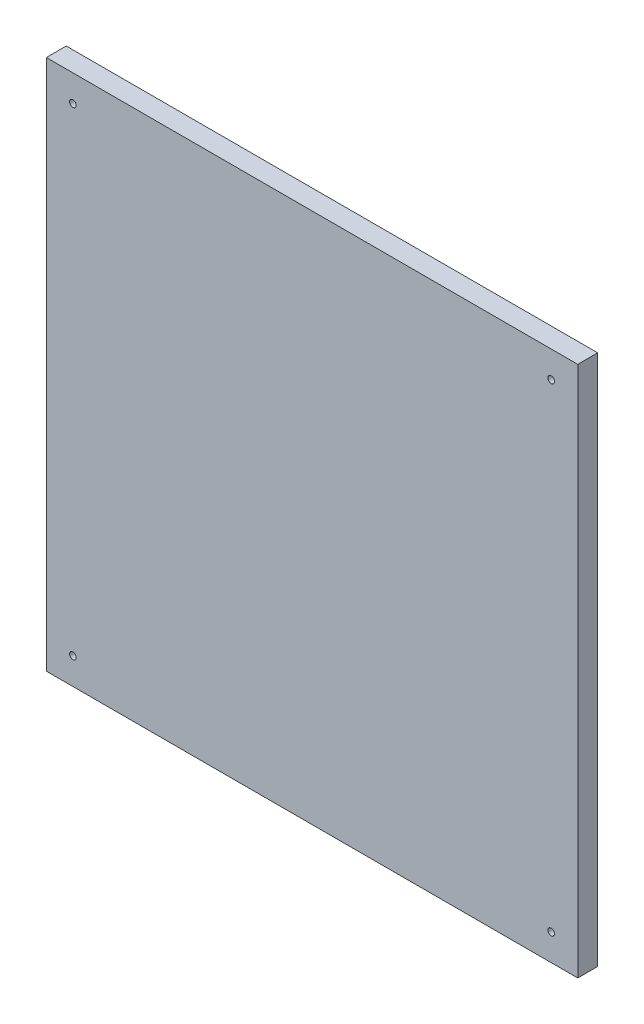
ISO-10303-21;
HEADER;
FILE_DESCRIPTION(('STEP AP214'),'2;1');
FILE_NAME('part.step','',(''),(''),'','','');
FILE_SCHEMA(('AUTOMOTIVE_DESIGN { 1 0 10303 214 1 1 1 1 }'));
ENDSEC;
DATA;
#1=APPLICATION_CONTEXT('core data for automotive mechanical design processes');
#2=APPLICATION_PROTOCOL_DEFINITION('international standard','automotive_design',2000,#1);
#3=PRODUCT_CONTEXT('',#1,'mechanical');
#4=PRODUCT('Part','Part','',(#3));
#5=PRODUCT_RELATED_PRODUCT_CATEGORY('part','',(#4));
#6=PRODUCT_DEFINITION_FORMATION('','',#4);
#7=PRODUCT_DEFINITION_CONTEXT('part definition',#1,'design');
#8=PRODUCT_DEFINITION('design','',#6,#7);
#9=PRODUCT_DEFINITION_SHAPE('','',#8);
#10=(LENGTH_UNIT() NAMED_UNIT(*) SI_UNIT(.MILLI.,.METRE.));
#11=(NAMED_UNIT(*) PLANE_ANGLE_UNIT() SI_UNIT($,.RADIAN.));
#12=(NAMED_UNIT(*) SI_UNIT($,.STERADIAN.) SOLID_ANGLE_UNIT());
#13=UNCERTAINTY_MEASURE_WITH_UNIT(LENGTH_MEASURE(1.E-05),#10,'distance_accuracy_value','');
#14=(GEOMETRIC_REPRESENTATION_CONTEXT(3) GLOBAL_UNCERTAINTY_ASSIGNED_CONTEXT((#13)) GLOBAL_UNIT_ASSIGNED_CONTEXT((#10,
#11,#12)) REPRESENTATION_CONTEXT('',''));
#15=CARTESIAN_POINT('',(0.,0.,0.));
#16=DIRECTION('',(0.,0.,1.));
#17=DIRECTION('',(1.,0.,0.));
#18=AXIS2_PLACEMENT_3D('',#15,#16,#17);
#19=CARTESIAN_POINT('',(400.,-400.,-30.));
#20=DIRECTION('',(1.,0.,0.));
#21=DIRECTION('',(0.,0.,-1.));
#22=AXIS2_PLACEMENT_3D('',#19,#20,#21);
#23=PLANE('',#22);
#24=DIRECTION('',(0.,1.,0.));
#25=VECTOR('',#24,1.);
#26=CARTESIAN_POINT('',(400.,-400.,0.));
#27=LINE('',#26,#25);
#28=CARTESIAN_POINT('',(400.,-400.,0.));
#29=VERTEX_POINT('',#28);
#30=CARTESIAN_POINT('',(400.,400.,0.));
#31=VERTEX_POINT('',#30);
#32=EDGE_CURVE('E102',#29,#31,#27,.T.);
#33=ORIENTED_EDGE('',*,*,#32,.F.);
#34=DIRECTION('',(0.,0.,1.));
#35=VECTOR('',#34,1.);
#36=CARTESIAN_POINT('',(400.,-400.,-30.));
#37=LINE('',#36,#35);
#38=CARTESIAN_POINT('',(400.,-400.,-30.));
#39=VERTEX_POINT('',#38);
#40=EDGE_CURVE('E11',#39,#29,#37,.T.);
#41=ORIENTED_EDGE('',*,*,#40,.F.);
#42=DIRECTION('',(0.,1.,0.));
#43=VECTOR('',#42,1.);
#44=CARTESIAN_POINT('',(400.,-400.,-30.));
#45=LINE('',#44,#43);
#46=CARTESIAN_POINT('',(400.,400.,-30.));
#47=VERTEX_POINT('',#46);
#48=EDGE_CURVE('E100',#39,#47,#45,.T.);
#49=ORIENTED_EDGE('',*,*,#48,.T.);
#50=DIRECTION('',(0.,0.,1.));
#51=VECTOR('',#50,1.);
#52=CARTESIAN_POINT('',(400.,400.,-30.));
#53=LINE('',#52,#51);
#54=EDGE_CURVE('E45',#47,#31,#53,.T.);
#55=ORIENTED_EDGE('',*,*,#54,.T.);
#56=EDGE_LOOP('',(#33,#41,#49,#55));
#57=FACE_BOUND('',#56,.T.);
#58=ADVANCED_FACE('F39',(#57),#23,.T.);
#59=CARTESIAN_POINT('',(-400.,-400.,-30.));
#60=DIRECTION('',(0.,-1.,0.));
#61=DIRECTION('',(0.,0.,-1.));
#62=AXIS2_PLACEMENT_3D('',#59,#60,#61);
#63=PLANE('',#62);
#64=DIRECTION('',(1.,0.,0.));
#65=VECTOR('',#64,1.);
#66=CARTESIAN_POINT('',(-400.,-400.,0.));
#67=LINE('',#66,#65);
#68=CARTESIAN_POINT('',(-400.,-400.,0.));
#69=VERTEX_POINT('',#68);
#70=EDGE_CURVE('E97',#69,#29,#67,.T.);
#71=ORIENTED_EDGE('',*,*,#70,.F.);
#72=DIRECTION('',(0.,0.,1.));
#73=VECTOR('',#72,1.);
#74=CARTESIAN_POINT('',(-400.,-400.,-30.));
#75=LINE('',#74,#73);
#76=CARTESIAN_POINT('',(-400.,-400.,-30.));
#77=VERTEX_POINT('',#76);
#78=EDGE_CURVE('E48',#77,#69,#75,.T.);
#79=ORIENTED_EDGE('',*,*,#78,.F.);
#80=DIRECTION('',(1.,0.,0.));
#81=VECTOR('',#80,1.);
#82=CARTESIAN_POINT('',(-400.,-400.,-30.));
#83=LINE('',#82,#81);
#84=EDGE_CURVE('E94',#77,#39,#83,.T.);
#85=ORIENTED_EDGE('',*,*,#84,.T.);
#86=ORIENTED_EDGE('',*,*,#40,.T.);
#87=EDGE_LOOP('',(#71,#79,#85,#86));
#88=FACE_BOUND('',#87,.T.);
#89=ADVANCED_FACE('F113',(#88),#63,.T.);
#90=CARTESIAN_POINT('',(-400.,-400.,-30.));
#91=DIRECTION('',(-1.,0.,0.));
#92=DIRECTION('',(0.,0.,1.));
#93=AXIS2_PLACEMENT_3D('',#90,#91,#92);
#94=PLANE('',#93);
#95=DIRECTION('',(0.,-1.,0.));
#96=VECTOR('',#95,1.);
#97=CARTESIAN_POINT('',(-400.,-400.,0.));
#98=LINE('',#97,#96);
#99=CARTESIAN_POINT('',(-400.,400.,0.));
#100=VERTEX_POINT('',#99);
#101=EDGE_CURVE('E90',#100,#69,#98,.T.);
#102=ORIENTED_EDGE('',*,*,#101,.F.);
#103=DIRECTION('',(0.,0.,1.));
#104=VECTOR('',#103,1.);
#105=CARTESIAN_POINT('',(-400.,400.,-30.));
#106=LINE('',#105,#104);
#107=CARTESIAN_POINT('',(-400.,400.,-30.));
#108=VERTEX_POINT('',#107);
#109=EDGE_CURVE('E84',#108,#100,#106,.T.);
#110=ORIENTED_EDGE('',*,*,#109,.F.);
#111=DIRECTION('',(0.,-1.,0.));
#112=VECTOR('',#111,1.);
#113=CARTESIAN_POINT('',(-400.,-400.,-30.));
#114=LINE('',#113,#112);
#115=EDGE_CURVE('E87',#108,#77,#114,.T.);
#116=ORIENTED_EDGE('',*,*,#115,.T.);
#117=ORIENTED_EDGE('',*,*,#78,.T.);
#118=EDGE_LOOP('',(#102,#110,#116,#117));
#119=FACE_BOUND('',#118,.T.);
#120=ADVANCED_FACE('F88',(#119),#94,.T.);
#121=CARTESIAN_POINT('',(-400.,400.,-30.));
#122=DIRECTION('',(0.,1.,0.));
#123=DIRECTION('',(0.,0.,1.));
#124=AXIS2_PLACEMENT_3D('',#121,#122,#123);
#125=PLANE('',#124);
#126=DIRECTION('',(-1.,0.,0.));
#127=VECTOR('',#126,1.);
#128=CARTESIAN_POINT('',(-400.,400.,0.));
#129=LINE('',#128,#127);
#130=EDGE_CURVE('E110',#31,#100,#129,.T.);
#131=ORIENTED_EDGE('',*,*,#130,.F.);
#132=ORIENTED_EDGE('',*,*,#54,.F.);
#133=DIRECTION('',(-1.,0.,0.));
#134=VECTOR('',#133,1.);
#135=CARTESIAN_POINT('',(-400.,400.,-30.));
#136=LINE('',#135,#134);
#137=EDGE_CURVE('E91',#47,#108,#136,.T.);
#138=ORIENTED_EDGE('',*,*,#137,.T.);
#139=ORIENTED_EDGE('',*,*,#109,.T.);
#140=EDGE_LOOP('',(#131,#132,#138,#139));
#141=FACE_BOUND('',#140,.T.);
#142=ADVANCED_FACE('F96',(#141),#125,.T.);
#143=CARTESIAN_POINT('',(0.,0.,-30.));
#144=DIRECTION('',(0.,0.,-1.));
#145=DIRECTION('',(-1.,0.,0.));
#146=AXIS2_PLACEMENT_3D('',#143,#144,#145);
#147=PLANE('',#146);
#148=ORIENTED_EDGE('',*,*,#48,.F.);
#149=ORIENTED_EDGE('',*,*,#84,.F.);
#150=ORIENTED_EDGE('',*,*,#115,.F.);
#151=ORIENTED_EDGE('',*,*,#137,.F.);
#152=EDGE_LOOP('',(#148,#149,#150,#151));
#153=FACE_BOUND('',#152,.T.);
#154=ADVANCED_FACE('F95',(#153),#147,.T.);
#155=CARTESIAN_POINT('',(0.,0.,0.));
#156=DIRECTION('',(0.,0.,-1.));
#157=DIRECTION('',(-1.,0.,0.));
#158=AXIS2_PLACEMENT_3D('',#155,#156,#157);
#159=PLANE('',#158);
#160=CARTESIAN_POINT('',(360.,-360.,0.));
#161=DIRECTION('',(0.,0.,1.));
#162=DIRECTION('',(1.,0.,0.));
#163=AXIS2_PLACEMENT_3D('',#160,#161,#162);
#164=CIRCLE('',#163,4.99999999999999);
#165=CARTESIAN_POINT('',(365.,-360.,0.));
#166=VERTEX_POINT('',#165);
#167=EDGE_CURVE('E173',#166,#166,#164,.T.);
#168=ORIENTED_EDGE('',*,*,#167,.F.);
#169=EDGE_LOOP('',(#168));
#170=FACE_BOUND('',#169,.T.);
#171=CARTESIAN_POINT('',(-360.,-360.,0.));
#172=DIRECTION('',(0.,0.,1.));
#173=DIRECTION('',(1.,0.,0.));
#174=AXIS2_PLACEMENT_3D('',#171,#172,#173);
#175=CIRCLE('',#174,4.99999999999999);
#176=CARTESIAN_POINT('',(-355.,-360.,0.));
#177=VERTEX_POINT('',#176);
#178=EDGE_CURVE('E168',#177,#177,#175,.T.);
#179=ORIENTED_EDGE('',*,*,#178,.F.);
#180=EDGE_LOOP('',(#179));
#181=FACE_BOUND('',#180,.T.);
#182=CARTESIAN_POINT('',(-360.,360.,0.));
#183=DIRECTION('',(0.,0.,1.));
#184=DIRECTION('',(1.,0.,0.));
#185=AXIS2_PLACEMENT_3D('',#182,#183,#184);
#186=CIRCLE('',#185,4.99999999999999);
#187=CARTESIAN_POINT('',(-355.,360.,0.));
#188=VERTEX_POINT('',#187);
#189=EDGE_CURVE('E176',#188,#188,#186,.T.);
#190=ORIENTED_EDGE('',*,*,#189,.F.);
#191=EDGE_LOOP('',(#190));
#192=FACE_BOUND('',#191,.T.);
#193=CARTESIAN_POINT('',(360.,360.,0.));
#194=DIRECTION('',(0.,0.,1.));
#195=DIRECTION('',(1.,0.,0.));
#196=AXIS2_PLACEMENT_3D('',#193,#194,#195);
#197=CIRCLE('',#196,4.99999999999999);
#198=CARTESIAN_POINT('',(365.,360.,0.));
#199=VERTEX_POINT('',#198);
#200=EDGE_CURVE('E183',#199,#199,#197,.T.);
#201=ORIENTED_EDGE('',*,*,#200,.F.);
#202=EDGE_LOOP('',(#201));
#203=FACE_BOUND('',#202,.T.);
#204=ORIENTED_EDGE('',*,*,#32,.T.);
#205=ORIENTED_EDGE('',*,*,#130,.T.);
#206=ORIENTED_EDGE('',*,*,#101,.T.);
#207=ORIENTED_EDGE('',*,*,#70,.T.);
#208=EDGE_LOOP('',(#204,#205,#206,#207));
#209=FACE_BOUND('',#208,.T.);
#210=ADVANCED_FACE('F111',(#170,#181,#192,#203,#209),#159,.F.);
#211=CARTESIAN_POINT('',(360.,360.,-10.));
#212=DIRECTION('',(0.,0.,1.));
#213=DIRECTION('',(1.,0.,0.));
#214=AXIS2_PLACEMENT_3D('',#211,#212,#213);
#215=CYLINDRICAL_SURFACE('',#214,4.99999999999999);
#216=CARTESIAN_POINT('',(360.,360.,-10.));
#217=DIRECTION('',(0.,0.,1.));
#218=DIRECTION('',(1.,0.,0.));
#219=AXIS2_PLACEMENT_3D('',#216,#217,#218);
#220=CIRCLE('',#219,4.99999999999999);
#221=CARTESIAN_POINT('',(365.,360.,-10.));
#222=VERTEX_POINT('',#221);
#223=EDGE_CURVE('E107',#222,#222,#220,.T.);
#224=ORIENTED_EDGE('',*,*,#223,.F.);
#225=EDGE_LOOP('',(#224));
#226=FACE_BOUND('',#225,.T.);
#227=ORIENTED_EDGE('',*,*,#200,.T.);
#228=EDGE_LOOP('',(#227));
#229=FACE_BOUND('',#228,.T.);
#230=ADVANCED_FACE('F132',(#226,#229),#215,.F.);
#231=CARTESIAN_POINT('',(360.,360.,-10.));
#232=DIRECTION('',(0.,0.,1.));
#233=DIRECTION('',(1.,0.,0.));
#234=AXIS2_PLACEMENT_3D('',#231,#232,#233);
#235=PLANE('',#234);
#236=ORIENTED_EDGE('',*,*,#223,.T.);
#237=EDGE_LOOP('',(#236));
#238=FACE_BOUND('',#237,.T.);
#239=ADVANCED_FACE('F140',(#238),#235,.T.);
#240=CARTESIAN_POINT('',(-360.,360.,-10.));
#241=DIRECTION('',(0.,0.,1.));
#242=DIRECTION('',(1.,0.,0.));
#243=AXIS2_PLACEMENT_3D('',#240,#241,#242);
#244=CYLINDRICAL_SURFACE('',#243,4.99999999999999);
#245=CARTESIAN_POINT('',(-360.,360.,-10.));
#246=DIRECTION('',(0.,0.,1.));
#247=DIRECTION('',(1.,0.,0.));
#248=AXIS2_PLACEMENT_3D('',#245,#246,#247);
#249=CIRCLE('',#248,4.99999999999999);
#250=CARTESIAN_POINT('',(-355.,360.,-10.));
#251=VERTEX_POINT('',#250);
#252=EDGE_CURVE('E185',#251,#251,#249,.T.);
#253=ORIENTED_EDGE('',*,*,#252,.F.);
#254=EDGE_LOOP('',(#253));
#255=FACE_BOUND('',#254,.T.);
#256=ORIENTED_EDGE('',*,*,#189,.T.);
#257=EDGE_LOOP('',(#256));
#258=FACE_BOUND('',#257,.T.);
#259=ADVANCED_FACE('F143',(#255,#258),#244,.F.);
#260=CARTESIAN_POINT('',(-360.,360.,-10.));
#261=DIRECTION('',(0.,0.,1.));
#262=DIRECTION('',(1.,0.,0.));
#263=AXIS2_PLACEMENT_3D('',#260,#261,#262);
#264=PLANE('',#263);
#265=ORIENTED_EDGE('',*,*,#252,.T.);
#266=EDGE_LOOP('',(#265));
#267=FACE_BOUND('',#266,.T.);
#268=ADVANCED_FACE('F144',(#267),#264,.T.);
#269=CARTESIAN_POINT('',(-360.,-360.,-10.));
#270=DIRECTION('',(0.,0.,1.));
#271=DIRECTION('',(1.,0.,0.));
#272=AXIS2_PLACEMENT_3D('',#269,#270,#271);
#273=CYLINDRICAL_SURFACE('',#272,4.99999999999999);
#274=CARTESIAN_POINT('',(-360.,-360.,-10.));
#275=DIRECTION('',(0.,0.,1.));
#276=DIRECTION('',(1.,0.,0.));
#277=AXIS2_PLACEMENT_3D('',#274,#275,#276);
#278=CIRCLE('',#277,4.99999999999999);
#279=CARTESIAN_POINT('',(-355.,-360.,-10.));
#280=VERTEX_POINT('',#279);
#281=EDGE_CURVE('E175',#280,#280,#278,.T.);
#282=ORIENTED_EDGE('',*,*,#281,.F.);
#283=EDGE_LOOP('',(#282));
#284=FACE_BOUND('',#283,.T.);
#285=ORIENTED_EDGE('',*,*,#178,.T.);
#286=EDGE_LOOP('',(#285));
#287=FACE_BOUND('',#286,.T.);
#288=ADVANCED_FACE('F149',(#284,#287),#273,.F.);
#289=CARTESIAN_POINT('',(-360.,-360.,-10.));
#290=DIRECTION('',(0.,0.,1.));
#291=DIRECTION('',(1.,0.,0.));
#292=AXIS2_PLACEMENT_3D('',#289,#290,#291);
#293=PLANE('',#292);
#294=ORIENTED_EDGE('',*,*,#281,.T.);
#295=EDGE_LOOP('',(#294));
#296=FACE_BOUND('',#295,.T.);
#297=ADVANCED_FACE('F153',(#296),#293,.T.);
#298=CARTESIAN_POINT('',(360.,-360.,-10.));
#299=DIRECTION('',(0.,0.,1.));
#300=DIRECTION('',(1.,0.,0.));
#301=AXIS2_PLACEMENT_3D('',#298,#299,#300);
#302=CYLINDRICAL_SURFACE('',#301,4.99999999999999);
#303=CARTESIAN_POINT('',(360.,-360.,-10.));
#304=DIRECTION('',(0.,0.,1.));
#305=DIRECTION('',(1.,0.,0.));
#306=AXIS2_PLACEMENT_3D('',#303,#304,#305);
#307=CIRCLE('',#306,4.99999999999999);
#308=CARTESIAN_POINT('',(365.,-360.,-10.));
#309=VERTEX_POINT('',#308);
#310=EDGE_CURVE('E166',#309,#309,#307,.T.);
#311=ORIENTED_EDGE('',*,*,#310,.F.);
#312=EDGE_LOOP('',(#311));
#313=FACE_BOUND('',#312,.T.);
#314=ORIENTED_EDGE('',*,*,#167,.T.);
#315=EDGE_LOOP('',(#314));
#316=FACE_BOUND('',#315,.T.);
#317=ADVANCED_FACE('F160',(#313,#316),#302,.F.);
#318=CARTESIAN_POINT('',(360.,-360.,-10.));
#319=DIRECTION('',(0.,0.,1.));
#320=DIRECTION('',(1.,0.,0.));
#321=AXIS2_PLACEMENT_3D('',#318,#319,#320);
#322=PLANE('',#321);
#323=ORIENTED_EDGE('',*,*,#310,.T.);
#324=EDGE_LOOP('',(#323));
#325=FACE_BOUND('',#324,.T.);
#326=ADVANCED_FACE('F161',(#325),#322,.T.);
#327=CLOSED_SHELL('',(#58,#89,#120,#142,#154,#210,#230,#239,#259,#268,#288,#297,#317,#326));
#328=MANIFOLD_SOLID_BREP('B2',#327);
#329=ADVANCED_BREP_SHAPE_REPRESENTATION('',(#18,#328),#14);
#330=SHAPE_DEFINITION_REPRESENTATION(#9,#329);
ENDSEC;
END-ISO-10303-21;
